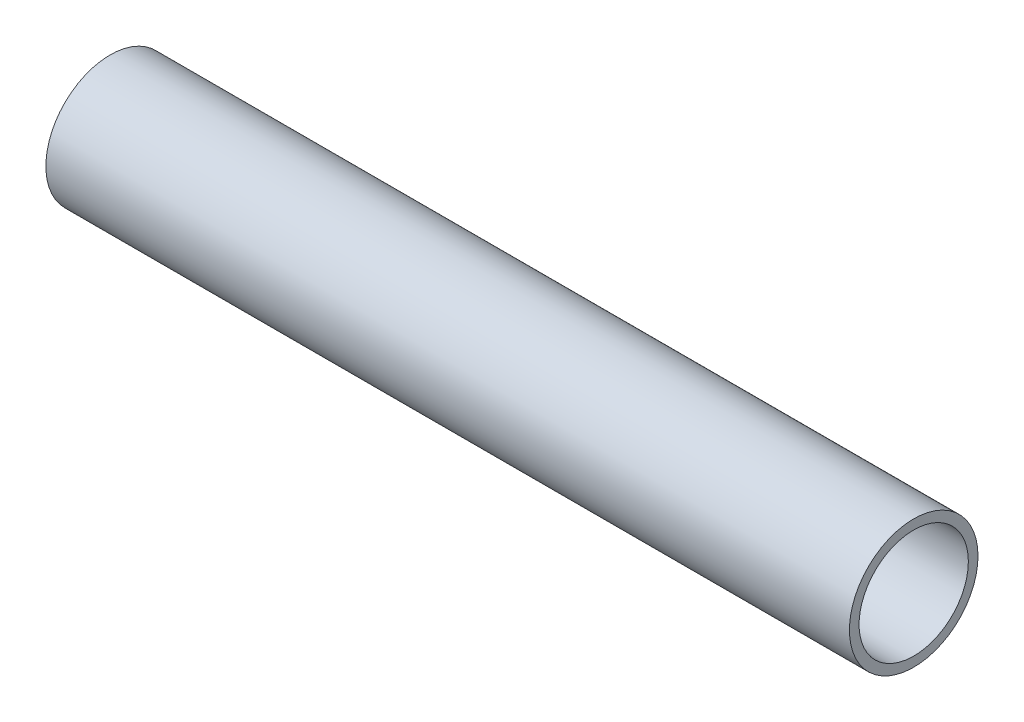
ISO-10303-21;
HEADER;
FILE_DESCRIPTION(('STEP AP214'),'2;1');
FILE_NAME('part.step','',(''),(''),'','','');
FILE_SCHEMA(('AUTOMOTIVE_DESIGN { 1 0 10303 214 1 1 1 1 }'));
ENDSEC;
DATA;
#1=APPLICATION_CONTEXT('core data for automotive mechanical design processes');
#2=APPLICATION_PROTOCOL_DEFINITION('international standard','automotive_design',2000,#1);
#3=PRODUCT_CONTEXT('',#1,'mechanical');
#4=PRODUCT('Part','Part','',(#3));
#5=PRODUCT_RELATED_PRODUCT_CATEGORY('part','',(#4));
#6=PRODUCT_DEFINITION_FORMATION('','',#4);
#7=PRODUCT_DEFINITION_CONTEXT('part definition',#1,'design');
#8=PRODUCT_DEFINITION('design','',#6,#7);
#9=PRODUCT_DEFINITION_SHAPE('','',#8);
#10=(LENGTH_UNIT() NAMED_UNIT(*) SI_UNIT(.MILLI.,.METRE.));
#11=(NAMED_UNIT(*) PLANE_ANGLE_UNIT() SI_UNIT($,.RADIAN.));
#12=(NAMED_UNIT(*) SI_UNIT($,.STERADIAN.) SOLID_ANGLE_UNIT());
#13=UNCERTAINTY_MEASURE_WITH_UNIT(LENGTH_MEASURE(1.E-05),#10,'distance_accuracy_value','');
#14=(GEOMETRIC_REPRESENTATION_CONTEXT(3) GLOBAL_UNCERTAINTY_ASSIGNED_CONTEXT((#13)) GLOBAL_UNIT_ASSIGNED_CONTEXT((#10,
#11,#12)) REPRESENTATION_CONTEXT('',''));
#15=CARTESIAN_POINT('',(0.,0.,0.));
#16=DIRECTION('',(0.,0.,1.));
#17=DIRECTION('',(1.,0.,0.));
#18=AXIS2_PLACEMENT_3D('',#15,#16,#17);
#19=CARTESIAN_POINT('',(12.5,0.,0.));
#20=DIRECTION('',(1.,0.,0.));
#21=DIRECTION('',(0.,0.,-1.));
#22=AXIS2_PLACEMENT_3D('',#19,#20,#21);
#23=PLANE('',#22);
#24=CARTESIAN_POINT('',(12.5,0.,0.));
#25=DIRECTION('',(1.,0.,0.));
#26=DIRECTION('',(0.,0.,-1.));
#27=AXIS2_PLACEMENT_3D('',#24,#25,#26);
#28=CIRCLE('',#27,2.);
#29=CARTESIAN_POINT('',(12.5,0.,-2.));
#30=VERTEX_POINT('',#29);
#31=EDGE_CURVE('E10',#30,#30,#28,.T.);
#32=ORIENTED_EDGE('',*,*,#31,.T.);
#33=EDGE_LOOP('',(#32));
#34=FACE_BOUND('',#33,.T.);
#35=CARTESIAN_POINT('',(12.5,0.,0.));
#36=DIRECTION('',(1.,0.,0.));
#37=DIRECTION('',(0.,0.,-1.));
#38=AXIS2_PLACEMENT_3D('',#35,#36,#37);
#39=CIRCLE('',#38,1.7);
#40=CARTESIAN_POINT('',(12.5,0.,-1.7));
#41=VERTEX_POINT('',#40);
#42=EDGE_CURVE('E46',#41,#41,#39,.T.);
#43=ORIENTED_EDGE('',*,*,#42,.F.);
#44=EDGE_LOOP('',(#43));
#45=FACE_BOUND('',#44,.T.);
#46=ADVANCED_FACE('F35',(#34,#45),#23,.T.);
#47=CARTESIAN_POINT('',(-12.5,0.,0.));
#48=DIRECTION('',(1.,0.,0.));
#49=DIRECTION('',(0.,0.,-1.));
#50=AXIS2_PLACEMENT_3D('',#47,#48,#49);
#51=PLANE('',#50);
#52=CARTESIAN_POINT('',(-12.5,0.,0.));
#53=DIRECTION('',(1.,0.,0.));
#54=DIRECTION('',(0.,0.,-1.));
#55=AXIS2_PLACEMENT_3D('',#52,#53,#54);
#56=CIRCLE('',#55,2.);
#57=CARTESIAN_POINT('',(-12.5,0.,-2.));
#58=VERTEX_POINT('',#57);
#59=EDGE_CURVE('E39',#58,#58,#56,.T.);
#60=ORIENTED_EDGE('',*,*,#59,.F.);
#61=EDGE_LOOP('',(#60));
#62=FACE_BOUND('',#61,.T.);
#63=CARTESIAN_POINT('',(-12.5,0.,0.));
#64=DIRECTION('',(1.,0.,0.));
#65=DIRECTION('',(0.,0.,-1.));
#66=AXIS2_PLACEMENT_3D('',#63,#64,#65);
#67=CIRCLE('',#66,1.7);
#68=CARTESIAN_POINT('',(-12.5,0.,-1.7));
#69=VERTEX_POINT('',#68);
#70=EDGE_CURVE('E48',#69,#69,#67,.T.);
#71=ORIENTED_EDGE('',*,*,#70,.T.);
#72=EDGE_LOOP('',(#71));
#73=FACE_BOUND('',#72,.T.);
#74=ADVANCED_FACE('F58',(#62,#73),#51,.F.);
#75=CARTESIAN_POINT('',(12.5,0.,0.));
#76=DIRECTION('',(-1.,0.,0.));
#77=DIRECTION('',(0.,0.,1.));
#78=AXIS2_PLACEMENT_3D('',#75,#76,#77);
#79=CYLINDRICAL_SURFACE('',#78,2.);
#80=ORIENTED_EDGE('',*,*,#31,.F.);
#81=EDGE_LOOP('',(#80));
#82=FACE_BOUND('',#81,.T.);
#83=ORIENTED_EDGE('',*,*,#59,.T.);
#84=EDGE_LOOP('',(#83));
#85=FACE_BOUND('',#84,.T.);
#86=ADVANCED_FACE('F37',(#82,#85),#79,.T.);
#87=CARTESIAN_POINT('',(12.5,0.,0.));
#88=DIRECTION('',(-1.,0.,0.));
#89=DIRECTION('',(0.,0.,1.));
#90=AXIS2_PLACEMENT_3D('',#87,#88,#89);
#91=CYLINDRICAL_SURFACE('',#90,1.7);
#92=ORIENTED_EDGE('',*,*,#42,.T.);
#93=EDGE_LOOP('',(#92));
#94=FACE_BOUND('',#93,.T.);
#95=ORIENTED_EDGE('',*,*,#70,.F.);
#96=EDGE_LOOP('',(#95));
#97=FACE_BOUND('',#96,.T.);
#98=ADVANCED_FACE('F54',(#94,#97),#91,.F.);
#99=CLOSED_SHELL('',(#46,#74,#86,#98));
#100=MANIFOLD_SOLID_BREP('B2',#99);
#101=ADVANCED_BREP_SHAPE_REPRESENTATION('',(#18,#100),#14);
#102=SHAPE_DEFINITION_REPRESENTATION(#9,#101);
ENDSEC;
END-ISO-10303-21;
